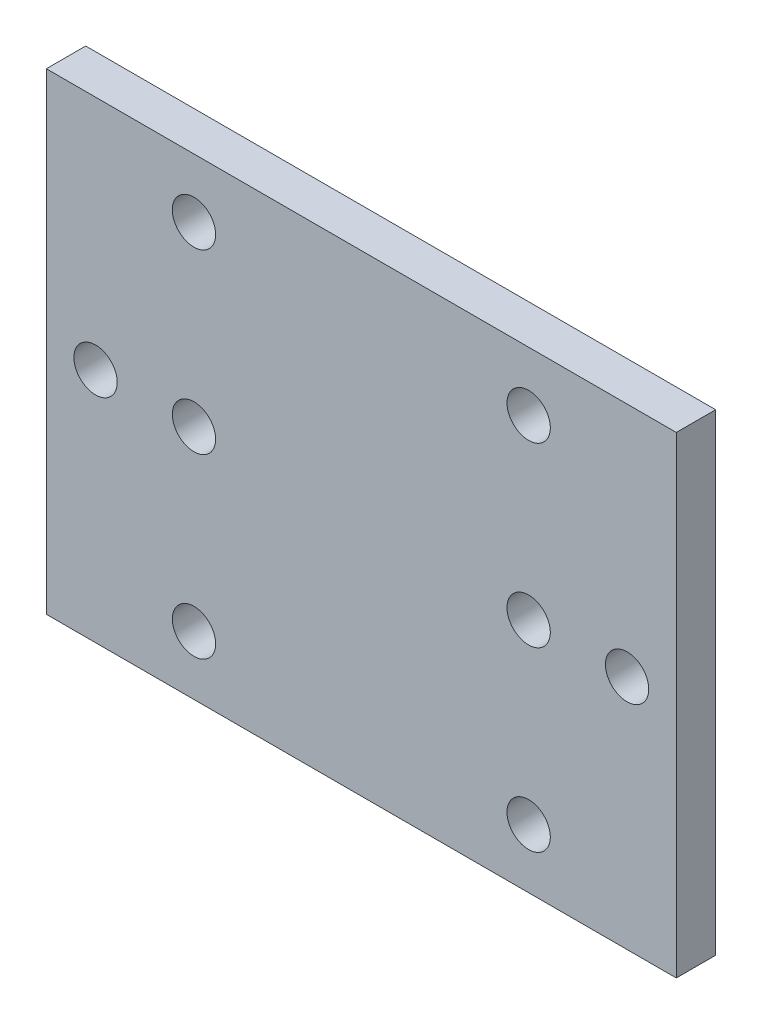
ISO-10303-21;
HEADER;
FILE_DESCRIPTION(('STEP AP214'),'2;1');
FILE_NAME('part.step','',(''),(''),'','','');
FILE_SCHEMA(('AUTOMOTIVE_DESIGN { 1 0 10303 214 1 1 1 1 }'));
ENDSEC;
DATA;
#1=APPLICATION_CONTEXT('core data for automotive mechanical design processes');
#2=APPLICATION_PROTOCOL_DEFINITION('international standard','automotive_design',2000,#1);
#3=PRODUCT_CONTEXT('',#1,'mechanical');
#4=PRODUCT('Part','Part','',(#3));
#5=PRODUCT_RELATED_PRODUCT_CATEGORY('part','',(#4));
#6=PRODUCT_DEFINITION_FORMATION('','',#4);
#7=PRODUCT_DEFINITION_CONTEXT('part definition',#1,'design');
#8=PRODUCT_DEFINITION('design','',#6,#7);
#9=PRODUCT_DEFINITION_SHAPE('','',#8);
#10=(LENGTH_UNIT() NAMED_UNIT(*) SI_UNIT(.MILLI.,.METRE.));
#11=(NAMED_UNIT(*) PLANE_ANGLE_UNIT() SI_UNIT($,.RADIAN.));
#12=(NAMED_UNIT(*) SI_UNIT($,.STERADIAN.) SOLID_ANGLE_UNIT());
#13=UNCERTAINTY_MEASURE_WITH_UNIT(LENGTH_MEASURE(1.E-05),#10,'distance_accuracy_value','');
#14=(GEOMETRIC_REPRESENTATION_CONTEXT(3) GLOBAL_UNCERTAINTY_ASSIGNED_CONTEXT((#13)) GLOBAL_UNIT_ASSIGNED_CONTEXT((#10,
#11,#12)) REPRESENTATION_CONTEXT('',''));
#15=CARTESIAN_POINT('',(0.,0.,0.));
#16=DIRECTION('',(0.,0.,1.));
#17=DIRECTION('',(1.,0.,0.));
#18=AXIS2_PLACEMENT_3D('',#15,#16,#17);
#19=CARTESIAN_POINT('',(0.,0.,12.7));
#20=DIRECTION('',(0.,0.,-1.));
#21=DIRECTION('',(-1.,0.,0.));
#22=AXIS2_PLACEMENT_3D('',#19,#20,#21);
#23=PLANE('',#22);
#24=CARTESIAN_POINT('',(-53.9750000000003,57.15,12.7));
#25=DIRECTION('',(0.,0.,1.));
#26=DIRECTION('',(1.,0.,0.));
#27=AXIS2_PLACEMENT_3D('',#24,#25,#26);
#28=CIRCLE('',#27,6.985);
#29=CARTESIAN_POINT('',(-46.9900000000003,57.15,12.7));
#30=VERTEX_POINT('',#29);
#31=EDGE_CURVE('E136',#30,#30,#28,.T.);
#32=ORIENTED_EDGE('',*,*,#31,.F.);
#33=EDGE_LOOP('',(#32));
#34=FACE_BOUND('',#33,.T.);
#35=CARTESIAN_POINT('',(53.9750000000001,-57.15,12.7));
#36=DIRECTION('',(0.,0.,-1.));
#37=DIRECTION('',(-1.,0.,0.));
#38=AXIS2_PLACEMENT_3D('',#35,#36,#37);
#39=CIRCLE('',#38,6.98500000000001);
#40=CARTESIAN_POINT('',(46.99,-57.15,12.7));
#41=VERTEX_POINT('',#40);
#42=EDGE_CURVE('E160',#41,#41,#39,.T.);
#43=ORIENTED_EDGE('',*,*,#42,.T.);
#44=EDGE_LOOP('',(#43));
#45=FACE_BOUND('',#44,.T.);
#46=CARTESIAN_POINT('',(53.9750000000001,57.15,12.7));
#47=DIRECTION('',(0.,0.,-1.));
#48=DIRECTION('',(-1.,0.,0.));
#49=AXIS2_PLACEMENT_3D('',#46,#47,#48);
#50=CIRCLE('',#49,6.98500000000002);
#51=CARTESIAN_POINT('',(46.99,57.15,12.7));
#52=VERTEX_POINT('',#51);
#53=EDGE_CURVE('E148',#52,#52,#50,.T.);
#54=ORIENTED_EDGE('',*,*,#53,.T.);
#55=EDGE_LOOP('',(#54));
#56=FACE_BOUND('',#55,.T.);
#57=CARTESIAN_POINT('',(-53.9750000000003,0.,12.7));
#58=DIRECTION('',(0.,0.,-1.));
#59=DIRECTION('',(-1.,0.,0.));
#60=AXIS2_PLACEMENT_3D('',#57,#58,#59);
#61=CIRCLE('',#60,6.98500000000002);
#62=CARTESIAN_POINT('',(-60.9600000000003,0.,12.7));
#63=VERTEX_POINT('',#62);
#64=EDGE_CURVE('E106',#63,#63,#61,.F.);
#65=ORIENTED_EDGE('',*,*,#64,.F.);
#66=EDGE_LOOP('',(#65));
#67=FACE_BOUND('',#66,.T.);
#68=DIRECTION('',(0.,1.,0.));
#69=VECTOR('',#68,1.);
#70=CARTESIAN_POINT('',(101.6,-76.2,12.7));
#71=LINE('',#70,#69);
#72=CARTESIAN_POINT('',(101.6,-76.2,12.7));
#73=VERTEX_POINT('',#72);
#74=CARTESIAN_POINT('',(101.6,76.2,12.7));
#75=VERTEX_POINT('',#74);
#76=EDGE_CURVE('E91',#73,#75,#71,.T.);
#77=ORIENTED_EDGE('',*,*,#76,.T.);
#78=DIRECTION('',(-1.,0.,0.));
#79=VECTOR('',#78,1.);
#80=CARTESIAN_POINT('',(-101.6,76.2,12.7));
#81=LINE('',#80,#79);
#82=CARTESIAN_POINT('',(-101.6,76.2,12.7));
#83=VERTEX_POINT('',#82);
#84=EDGE_CURVE('E86',#75,#83,#81,.T.);
#85=ORIENTED_EDGE('',*,*,#84,.T.);
#86=DIRECTION('',(0.,-1.,0.));
#87=VECTOR('',#86,1.);
#88=CARTESIAN_POINT('',(-101.6,-76.2,12.7));
#89=LINE('',#88,#87);
#90=CARTESIAN_POINT('',(-101.6,-76.2,12.7));
#91=VERTEX_POINT('',#90);
#92=EDGE_CURVE('E89',#83,#91,#89,.T.);
#93=ORIENTED_EDGE('',*,*,#92,.T.);
#94=DIRECTION('',(1.,0.,0.));
#95=VECTOR('',#94,1.);
#96=CARTESIAN_POINT('',(-101.6,-76.2,12.7));
#97=LINE('',#96,#95);
#98=EDGE_CURVE('E56',#91,#73,#97,.T.);
#99=ORIENTED_EDGE('',*,*,#98,.T.);
#100=EDGE_LOOP('',(#77,#85,#93,#99));
#101=FACE_BOUND('',#100,.T.);
#102=CARTESIAN_POINT('',(85.7250000000001,0.,12.7));
#103=DIRECTION('',(0.,0.,-1.));
#104=DIRECTION('',(-1.,0.,0.));
#105=AXIS2_PLACEMENT_3D('',#102,#103,#104);
#106=CIRCLE('',#105,6.98500000000001);
#107=CARTESIAN_POINT('',(78.74,0.,12.7));
#108=VERTEX_POINT('',#107);
#109=EDGE_CURVE('E154',#108,#108,#106,.T.);
#110=ORIENTED_EDGE('',*,*,#109,.T.);
#111=EDGE_LOOP('',(#110));
#112=FACE_BOUND('',#111,.T.);
#113=CARTESIAN_POINT('',(-85.7250000000003,0.,12.7));
#114=DIRECTION('',(0.,0.,-1.));
#115=DIRECTION('',(-1.,0.,0.));
#116=AXIS2_PLACEMENT_3D('',#113,#114,#115);
#117=CIRCLE('',#116,6.985);
#118=CARTESIAN_POINT('',(-92.7100000000003,0.,12.7));
#119=VERTEX_POINT('',#118);
#120=EDGE_CURVE('E131',#119,#119,#117,.F.);
#121=ORIENTED_EDGE('',*,*,#120,.F.);
#122=EDGE_LOOP('',(#121));
#123=FACE_BOUND('',#122,.T.);
#124=CARTESIAN_POINT('',(-53.9750000000004,-57.15,12.7));
#125=DIRECTION('',(0.,0.,-1.));
#126=DIRECTION('',(-1.,0.,0.));
#127=AXIS2_PLACEMENT_3D('',#124,#125,#126);
#128=CIRCLE('',#127,6.98499999999998);
#129=CARTESIAN_POINT('',(-60.9600000000003,-57.15,12.7));
#130=VERTEX_POINT('',#129);
#131=EDGE_CURVE('E124',#130,#130,#128,.F.);
#132=ORIENTED_EDGE('',*,*,#131,.F.);
#133=EDGE_LOOP('',(#132));
#134=FACE_BOUND('',#133,.T.);
#135=CARTESIAN_POINT('',(53.9750000000001,0.,12.7));
#136=DIRECTION('',(0.,0.,-1.));
#137=DIRECTION('',(-1.,0.,0.));
#138=AXIS2_PLACEMENT_3D('',#135,#136,#137);
#139=CIRCLE('',#138,6.98500000000002);
#140=CARTESIAN_POINT('',(46.99,0.,12.7));
#141=VERTEX_POINT('',#140);
#142=EDGE_CURVE('E143',#141,#141,#139,.T.);
#143=ORIENTED_EDGE('',*,*,#142,.T.);
#144=EDGE_LOOP('',(#143));
#145=FACE_BOUND('',#144,.T.);
#146=ADVANCED_FACE('F39',(#34,#45,#56,#67,#101,#112,#123,#134,#145),#23,.F.);
#147=CARTESIAN_POINT('',(0.,0.,0.));
#148=DIRECTION('',(0.,0.,-1.));
#149=DIRECTION('',(-1.,0.,0.));
#150=AXIS2_PLACEMENT_3D('',#147,#148,#149);
#151=PLANE('',#150);
#152=CARTESIAN_POINT('',(-53.9750000000003,57.15,0.));
#153=DIRECTION('',(0.,0.,1.));
#154=DIRECTION('',(1.,0.,0.));
#155=AXIS2_PLACEMENT_3D('',#152,#153,#154);
#156=CIRCLE('',#155,6.985);
#157=CARTESIAN_POINT('',(-46.9900000000003,57.15,0.));
#158=VERTEX_POINT('',#157);
#159=EDGE_CURVE('E139',#158,#158,#156,.T.);
#160=ORIENTED_EDGE('',*,*,#159,.T.);
#161=EDGE_LOOP('',(#160));
#162=FACE_BOUND('',#161,.T.);
#163=CARTESIAN_POINT('',(-53.9750000000004,-57.15,0.));
#164=DIRECTION('',(0.,0.,-1.));
#165=DIRECTION('',(-1.,0.,0.));
#166=AXIS2_PLACEMENT_3D('',#163,#164,#165);
#167=CIRCLE('',#166,6.98499999999998);
#168=CARTESIAN_POINT('',(-60.9600000000003,-57.15,0.));
#169=VERTEX_POINT('',#168);
#170=EDGE_CURVE('E127',#169,#169,#167,.F.);
#171=ORIENTED_EDGE('',*,*,#170,.T.);
#172=EDGE_LOOP('',(#171));
#173=FACE_BOUND('',#172,.T.);
#174=CARTESIAN_POINT('',(-85.7250000000003,0.,0.));
#175=DIRECTION('',(0.,0.,-1.));
#176=DIRECTION('',(-1.,0.,0.));
#177=AXIS2_PLACEMENT_3D('',#174,#175,#176);
#178=CIRCLE('',#177,6.985);
#179=CARTESIAN_POINT('',(-92.7100000000003,0.,0.));
#180=VERTEX_POINT('',#179);
#181=EDGE_CURVE('E121',#180,#180,#178,.F.);
#182=ORIENTED_EDGE('',*,*,#181,.T.);
#183=EDGE_LOOP('',(#182));
#184=FACE_BOUND('',#183,.T.);
#185=CARTESIAN_POINT('',(-53.9750000000003,0.,0.));
#186=DIRECTION('',(0.,0.,-1.));
#187=DIRECTION('',(-1.,0.,0.));
#188=AXIS2_PLACEMENT_3D('',#185,#186,#187);
#189=CIRCLE('',#188,6.98500000000002);
#190=CARTESIAN_POINT('',(-60.9600000000003,0.,0.));
#191=VERTEX_POINT('',#190);
#192=EDGE_CURVE('E118',#191,#191,#189,.F.);
#193=ORIENTED_EDGE('',*,*,#192,.T.);
#194=EDGE_LOOP('',(#193));
#195=FACE_BOUND('',#194,.T.);
#196=DIRECTION('',(0.,1.,0.));
#197=VECTOR('',#196,1.);
#198=CARTESIAN_POINT('',(101.6,-76.2,0.));
#199=LINE('',#198,#197);
#200=CARTESIAN_POINT('',(101.6,-76.2,0.));
#201=VERTEX_POINT('',#200);
#202=CARTESIAN_POINT('',(101.6,76.2,0.));
#203=VERTEX_POINT('',#202);
#204=EDGE_CURVE('E103',#201,#203,#199,.T.);
#205=ORIENTED_EDGE('',*,*,#204,.F.);
#206=DIRECTION('',(1.,0.,0.));
#207=VECTOR('',#206,1.);
#208=CARTESIAN_POINT('',(-101.6,-76.2,0.));
#209=LINE('',#208,#207);
#210=CARTESIAN_POINT('',(-101.6,-76.2,0.));
#211=VERTEX_POINT('',#210);
#212=EDGE_CURVE('E79',#211,#201,#209,.T.);
#213=ORIENTED_EDGE('',*,*,#212,.F.);
#214=DIRECTION('',(0.,-1.,0.));
#215=VECTOR('',#214,1.);
#216=CARTESIAN_POINT('',(-101.6,-76.2,0.));
#217=LINE('',#216,#215);
#218=CARTESIAN_POINT('',(-101.6,76.2,0.));
#219=VERTEX_POINT('',#218);
#220=EDGE_CURVE('E73',#219,#211,#217,.T.);
#221=ORIENTED_EDGE('',*,*,#220,.F.);
#222=DIRECTION('',(-1.,0.,0.));
#223=VECTOR('',#222,1.);
#224=CARTESIAN_POINT('',(-101.6,76.2,0.));
#225=LINE('',#224,#223);
#226=EDGE_CURVE('E95',#203,#219,#225,.T.);
#227=ORIENTED_EDGE('',*,*,#226,.F.);
#228=EDGE_LOOP('',(#205,#213,#221,#227));
#229=FACE_BOUND('',#228,.T.);
#230=CARTESIAN_POINT('',(53.9750000000001,57.15,0.));
#231=DIRECTION('',(0.,0.,-1.));
#232=DIRECTION('',(-1.,0.,0.));
#233=AXIS2_PLACEMENT_3D('',#230,#231,#232);
#234=CIRCLE('',#233,6.98500000000002);
#235=CARTESIAN_POINT('',(46.99,57.15,0.));
#236=VERTEX_POINT('',#235);
#237=EDGE_CURVE('E151',#236,#236,#234,.T.);
#238=ORIENTED_EDGE('',*,*,#237,.F.);
#239=EDGE_LOOP('',(#238));
#240=FACE_BOUND('',#239,.T.);
#241=CARTESIAN_POINT('',(85.7250000000001,0.,0.));
#242=DIRECTION('',(0.,0.,-1.));
#243=DIRECTION('',(-1.,0.,0.));
#244=AXIS2_PLACEMENT_3D('',#241,#242,#243);
#245=CIRCLE('',#244,6.98500000000001);
#246=CARTESIAN_POINT('',(78.74,0.,0.));
#247=VERTEX_POINT('',#246);
#248=EDGE_CURVE('E157',#247,#247,#245,.T.);
#249=ORIENTED_EDGE('',*,*,#248,.F.);
#250=EDGE_LOOP('',(#249));
#251=FACE_BOUND('',#250,.T.);
#252=CARTESIAN_POINT('',(53.9750000000001,-57.15,0.));
#253=DIRECTION('',(0.,0.,-1.));
#254=DIRECTION('',(-1.,0.,0.));
#255=AXIS2_PLACEMENT_3D('',#252,#253,#254);
#256=CIRCLE('',#255,6.98500000000001);
#257=CARTESIAN_POINT('',(46.99,-57.15,0.));
#258=VERTEX_POINT('',#257);
#259=EDGE_CURVE('E140',#258,#258,#256,.T.);
#260=ORIENTED_EDGE('',*,*,#259,.F.);
#261=EDGE_LOOP('',(#260));
#262=FACE_BOUND('',#261,.T.);
#263=CARTESIAN_POINT('',(53.9750000000001,0.,0.));
#264=DIRECTION('',(0.,0.,-1.));
#265=DIRECTION('',(-1.,0.,0.));
#266=AXIS2_PLACEMENT_3D('',#263,#264,#265);
#267=CIRCLE('',#266,6.98500000000002);
#268=CARTESIAN_POINT('',(46.99,0.,0.));
#269=VERTEX_POINT('',#268);
#270=EDGE_CURVE('E128',#269,#269,#267,.T.);
#271=ORIENTED_EDGE('',*,*,#270,.F.);
#272=EDGE_LOOP('',(#271));
#273=FACE_BOUND('',#272,.T.);
#274=ADVANCED_FACE('F114',(#162,#173,#184,#195,#229,#240,#251,#262,#273),#151,.T.);
#275=CARTESIAN_POINT('',(101.6,-76.2,12.7));
#276=DIRECTION('',(-1.,0.,0.));
#277=DIRECTION('',(0.,0.,1.));
#278=AXIS2_PLACEMENT_3D('',#275,#276,#277);
#279=PLANE('',#278);
#280=ORIENTED_EDGE('',*,*,#204,.T.);
#281=DIRECTION('',(0.,0.,-1.));
#282=VECTOR('',#281,1.);
#283=CARTESIAN_POINT('',(101.6,76.2,12.7));
#284=LINE('',#283,#282);
#285=EDGE_CURVE('E11',#75,#203,#284,.T.);
#286=ORIENTED_EDGE('',*,*,#285,.F.);
#287=ORIENTED_EDGE('',*,*,#76,.F.);
#288=DIRECTION('',(0.,0.,-1.));
#289=VECTOR('',#288,1.);
#290=CARTESIAN_POINT('',(101.6,-76.2,12.7));
#291=LINE('',#290,#289);
#292=EDGE_CURVE('E99',#73,#201,#291,.T.);
#293=ORIENTED_EDGE('',*,*,#292,.T.);
#294=EDGE_LOOP('',(#280,#286,#287,#293));
#295=FACE_BOUND('',#294,.T.);
#296=ADVANCED_FACE('F41',(#295),#279,.F.);
#297=CARTESIAN_POINT('',(-101.6,76.2,12.7));
#298=DIRECTION('',(0.,-1.,0.));
#299=DIRECTION('',(0.,0.,-1.));
#300=AXIS2_PLACEMENT_3D('',#297,#298,#299);
#301=PLANE('',#300);
#302=ORIENTED_EDGE('',*,*,#226,.T.);
#303=DIRECTION('',(0.,0.,-1.));
#304=VECTOR('',#303,1.);
#305=CARTESIAN_POINT('',(-101.6,76.2,12.7));
#306=LINE('',#305,#304);
#307=EDGE_CURVE('E48',#83,#219,#306,.T.);
#308=ORIENTED_EDGE('',*,*,#307,.F.);
#309=ORIENTED_EDGE('',*,*,#84,.F.);
#310=ORIENTED_EDGE('',*,*,#285,.T.);
#311=EDGE_LOOP('',(#302,#308,#309,#310));
#312=FACE_BOUND('',#311,.T.);
#313=ADVANCED_FACE('F94',(#312),#301,.F.);
#314=CARTESIAN_POINT('',(-101.6,-76.2,12.7));
#315=DIRECTION('',(1.,0.,0.));
#316=DIRECTION('',(0.,0.,-1.));
#317=AXIS2_PLACEMENT_3D('',#314,#315,#316);
#318=PLANE('',#317);
#319=ORIENTED_EDGE('',*,*,#220,.T.);
#320=DIRECTION('',(0.,0.,-1.));
#321=VECTOR('',#320,1.);
#322=CARTESIAN_POINT('',(-101.6,-76.2,12.7));
#323=LINE('',#322,#321);
#324=EDGE_CURVE('E96',#91,#211,#323,.T.);
#325=ORIENTED_EDGE('',*,*,#324,.F.);
#326=ORIENTED_EDGE('',*,*,#92,.F.);
#327=ORIENTED_EDGE('',*,*,#307,.T.);
#328=EDGE_LOOP('',(#319,#325,#326,#327));
#329=FACE_BOUND('',#328,.T.);
#330=ADVANCED_FACE('F97',(#329),#318,.F.);
#331=CARTESIAN_POINT('',(-101.6,-76.2,12.7));
#332=DIRECTION('',(0.,1.,0.));
#333=DIRECTION('',(0.,0.,1.));
#334=AXIS2_PLACEMENT_3D('',#331,#332,#333);
#335=PLANE('',#334);
#336=ORIENTED_EDGE('',*,*,#212,.T.);
#337=ORIENTED_EDGE('',*,*,#292,.F.);
#338=ORIENTED_EDGE('',*,*,#98,.F.);
#339=ORIENTED_EDGE('',*,*,#324,.T.);
#340=EDGE_LOOP('',(#336,#337,#338,#339));
#341=FACE_BOUND('',#340,.T.);
#342=ADVANCED_FACE('F111',(#341),#335,.F.);
#343=CARTESIAN_POINT('',(-53.9750000000003,0.,12.7));
#344=DIRECTION('',(0.,0.,-1.));
#345=DIRECTION('',(-1.,0.,0.));
#346=AXIS2_PLACEMENT_3D('',#343,#344,#345);
#347=CYLINDRICAL_SURFACE('',#346,6.98500000000002);
#348=ORIENTED_EDGE('',*,*,#64,.T.);
#349=EDGE_LOOP('',(#348));
#350=FACE_BOUND('',#349,.T.);
#351=ORIENTED_EDGE('',*,*,#192,.F.);
#352=EDGE_LOOP('',(#351));
#353=FACE_BOUND('',#352,.T.);
#354=ADVANCED_FACE('F199',(#350,#353),#347,.F.);
#355=CARTESIAN_POINT('',(53.9750000000001,57.15,12.7));
#356=DIRECTION('',(0.,0.,-1.));
#357=DIRECTION('',(-1.,0.,0.));
#358=AXIS2_PLACEMENT_3D('',#355,#356,#357);
#359=CYLINDRICAL_SURFACE('',#358,6.98500000000002);
#360=ORIENTED_EDGE('',*,*,#53,.F.);
#361=EDGE_LOOP('',(#360));
#362=FACE_BOUND('',#361,.T.);
#363=ORIENTED_EDGE('',*,*,#237,.T.);
#364=EDGE_LOOP('',(#363));
#365=FACE_BOUND('',#364,.T.);
#366=ADVANCED_FACE('F227',(#362,#365),#359,.F.);
#367=CARTESIAN_POINT('',(85.7250000000001,0.,12.7));
#368=DIRECTION('',(0.,0.,-1.));
#369=DIRECTION('',(-1.,0.,0.));
#370=AXIS2_PLACEMENT_3D('',#367,#368,#369);
#371=CYLINDRICAL_SURFACE('',#370,6.98500000000001);
#372=ORIENTED_EDGE('',*,*,#109,.F.);
#373=EDGE_LOOP('',(#372));
#374=FACE_BOUND('',#373,.T.);
#375=ORIENTED_EDGE('',*,*,#248,.T.);
#376=EDGE_LOOP('',(#375));
#377=FACE_BOUND('',#376,.T.);
#378=ADVANCED_FACE('F236',(#374,#377),#371,.F.);
#379=CARTESIAN_POINT('',(53.9750000000001,-57.15,12.7));
#380=DIRECTION('',(0.,0.,-1.));
#381=DIRECTION('',(-1.,0.,0.));
#382=AXIS2_PLACEMENT_3D('',#379,#380,#381);
#383=CYLINDRICAL_SURFACE('',#382,6.98500000000001);
#384=ORIENTED_EDGE('',*,*,#42,.F.);
#385=EDGE_LOOP('',(#384));
#386=FACE_BOUND('',#385,.T.);
#387=ORIENTED_EDGE('',*,*,#259,.T.);
#388=EDGE_LOOP('',(#387));
#389=FACE_BOUND('',#388,.T.);
#390=ADVANCED_FACE('F166',(#386,#389),#383,.F.);
#391=CARTESIAN_POINT('',(-85.7250000000003,0.,12.7));
#392=DIRECTION('',(0.,0.,-1.));
#393=DIRECTION('',(-1.,0.,0.));
#394=AXIS2_PLACEMENT_3D('',#391,#392,#393);
#395=CYLINDRICAL_SURFACE('',#394,6.985);
#396=ORIENTED_EDGE('',*,*,#120,.T.);
#397=EDGE_LOOP('',(#396));
#398=FACE_BOUND('',#397,.T.);
#399=ORIENTED_EDGE('',*,*,#181,.F.);
#400=EDGE_LOOP('',(#399));
#401=FACE_BOUND('',#400,.T.);
#402=ADVANCED_FACE('F186',(#398,#401),#395,.F.);
#403=CARTESIAN_POINT('',(-53.9750000000004,-57.15,12.7));
#404=DIRECTION('',(0.,0.,-1.));
#405=DIRECTION('',(-1.,0.,0.));
#406=AXIS2_PLACEMENT_3D('',#403,#404,#405);
#407=CYLINDRICAL_SURFACE('',#406,6.98499999999998);
#408=ORIENTED_EDGE('',*,*,#131,.T.);
#409=EDGE_LOOP('',(#408));
#410=FACE_BOUND('',#409,.T.);
#411=ORIENTED_EDGE('',*,*,#170,.F.);
#412=EDGE_LOOP('',(#411));
#413=FACE_BOUND('',#412,.T.);
#414=ADVANCED_FACE('F177',(#410,#413),#407,.F.);
#415=CARTESIAN_POINT('',(53.9750000000001,0.,12.7));
#416=DIRECTION('',(0.,0.,-1.));
#417=DIRECTION('',(-1.,0.,0.));
#418=AXIS2_PLACEMENT_3D('',#415,#416,#417);
#419=CYLINDRICAL_SURFACE('',#418,6.98500000000002);
#420=ORIENTED_EDGE('',*,*,#142,.F.);
#421=EDGE_LOOP('',(#420));
#422=FACE_BOUND('',#421,.T.);
#423=ORIENTED_EDGE('',*,*,#270,.T.);
#424=EDGE_LOOP('',(#423));
#425=FACE_BOUND('',#424,.T.);
#426=ADVANCED_FACE('F174',(#422,#425),#419,.F.);
#427=CARTESIAN_POINT('',(-53.9750000000003,57.15,12.7));
#428=DIRECTION('',(0.,0.,-1.));
#429=DIRECTION('',(-1.,0.,0.));
#430=AXIS2_PLACEMENT_3D('',#427,#428,#429);
#431=CYLINDRICAL_SURFACE('',#430,6.985);
#432=ORIENTED_EDGE('',*,*,#31,.T.);
#433=EDGE_LOOP('',(#432));
#434=FACE_BOUND('',#433,.T.);
#435=ORIENTED_EDGE('',*,*,#159,.F.);
#436=EDGE_LOOP('',(#435));
#437=FACE_BOUND('',#436,.T.);
#438=ADVANCED_FACE('F176',(#434,#437),#431,.F.);
#439=CLOSED_SHELL('',(#146,#274,#296,#313,#330,#342,#354,#366,#378,#390,#402,#414,#426,#438));
#440=MANIFOLD_SOLID_BREP('B2',#439);
#441=ADVANCED_BREP_SHAPE_REPRESENTATION('',(#18,#440),#14);
#442=SHAPE_DEFINITION_REPRESENTATION(#9,#441);
ENDSEC;
END-ISO-10303-21;
